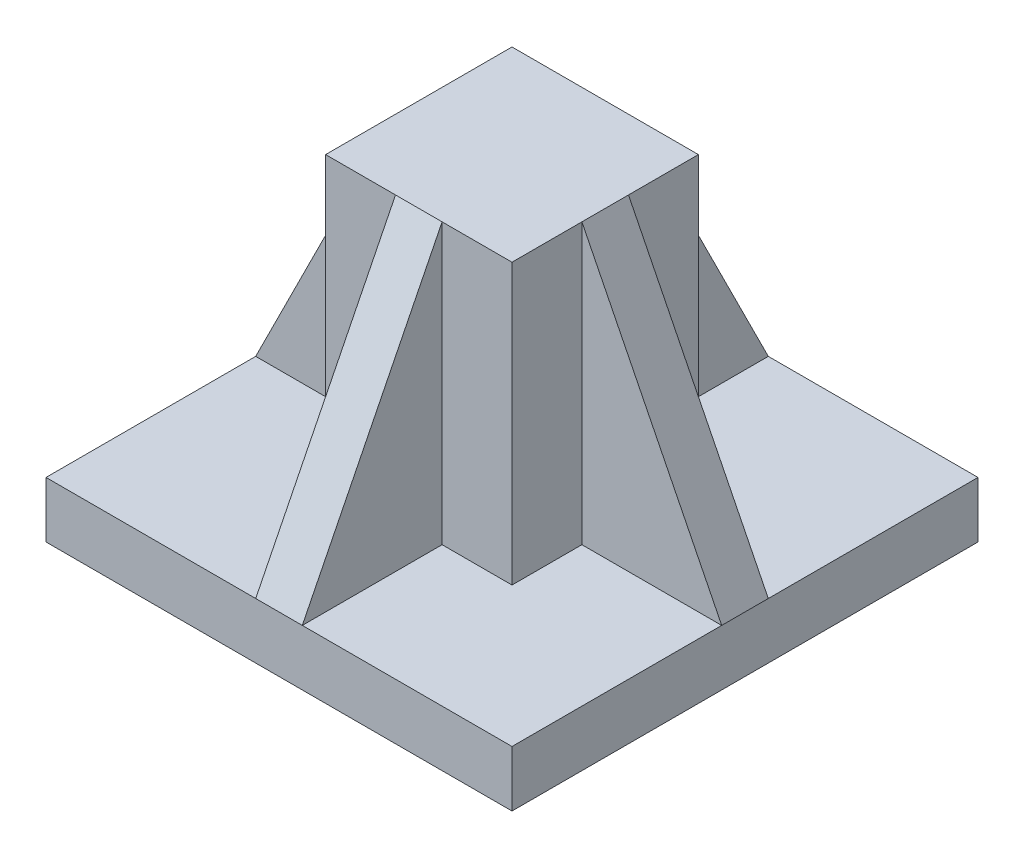
ISO-10303-21;
HEADER;
FILE_DESCRIPTION(('STEP AP214'),'2;1');
FILE_NAME('part.step','',(''),(''),'','','');
FILE_SCHEMA(('AUTOMOTIVE_DESIGN { 1 0 10303 214 1 1 1 1 }'));
ENDSEC;
DATA;
#1=APPLICATION_CONTEXT('core data for automotive mechanical design processes');
#2=APPLICATION_PROTOCOL_DEFINITION('international standard','automotive_design',2000,#1);
#3=PRODUCT_CONTEXT('',#1,'mechanical');
#4=PRODUCT('Part','Part','',(#3));
#5=PRODUCT_RELATED_PRODUCT_CATEGORY('part','',(#4));
#6=PRODUCT_DEFINITION_FORMATION('','',#4);
#7=PRODUCT_DEFINITION_CONTEXT('part definition',#1,'design');
#8=PRODUCT_DEFINITION('design','',#6,#7);
#9=PRODUCT_DEFINITION_SHAPE('','',#8);
#10=(LENGTH_UNIT() NAMED_UNIT(*) SI_UNIT(.MILLI.,.METRE.));
#11=(NAMED_UNIT(*) PLANE_ANGLE_UNIT() SI_UNIT($,.RADIAN.));
#12=(NAMED_UNIT(*) SI_UNIT($,.STERADIAN.) SOLID_ANGLE_UNIT());
#13=UNCERTAINTY_MEASURE_WITH_UNIT(LENGTH_MEASURE(1.E-05),#10,'distance_accuracy_value','');
#14=(GEOMETRIC_REPRESENTATION_CONTEXT(3) GLOBAL_UNCERTAINTY_ASSIGNED_CONTEXT((#13)) GLOBAL_UNIT_ASSIGNED_CONTEXT((#10,
#11,#12)) REPRESENTATION_CONTEXT('',''));
#15=CARTESIAN_POINT('',(0.,0.,0.));
#16=DIRECTION('',(0.,0.,1.));
#17=DIRECTION('',(1.,0.,0.));
#18=AXIS2_PLACEMENT_3D('',#15,#16,#17);
#19=CARTESIAN_POINT('',(0.,72.,0.));
#20=DIRECTION('',(0.,1.,0.));
#21=DIRECTION('',(0.,0.,1.));
#22=AXIS2_PLACEMENT_3D('',#19,#20,#21);
#23=PLANE('',#22);
#24=DIRECTION('',(0.,0.,1.));
#25=VECTOR('',#24,1.);
#26=CARTESIAN_POINT('',(20.,72.,-50.));
#27=LINE('',#26,#25);
#28=CARTESIAN_POINT('',(20.,72.,-5.00000000000001));
#29=VERTEX_POINT('',#28);
#30=CARTESIAN_POINT('',(20.,72.,4.99999999999999));
#31=VERTEX_POINT('',#30);
#32=EDGE_CURVE('E166',#29,#31,#27,.T.);
#33=ORIENTED_EDGE('',*,*,#32,.F.);
#34=DIRECTION('',(0.,0.,-1.));
#35=VECTOR('',#34,1.);
#36=CARTESIAN_POINT('',(20.,72.,-5.));
#37=LINE('',#36,#35);
#38=CARTESIAN_POINT('',(20.,72.,-20.));
#39=VERTEX_POINT('',#38);
#40=EDGE_CURVE('E206',#29,#39,#37,.T.);
#41=ORIENTED_EDGE('',*,*,#40,.T.);
#42=DIRECTION('',(1.,0.,0.));
#43=VECTOR('',#42,1.);
#44=CARTESIAN_POINT('',(5.,72.,-20.));
#45=LINE('',#44,#43);
#46=CARTESIAN_POINT('',(5.,72.,-20.));
#47=VERTEX_POINT('',#46);
#48=EDGE_CURVE('E283',#47,#39,#45,.T.);
#49=ORIENTED_EDGE('',*,*,#48,.F.);
#50=DIRECTION('',(1.,0.,0.));
#51=VECTOR('',#50,1.);
#52=CARTESIAN_POINT('',(-50.,72.,-20.));
#53=LINE('',#52,#51);
#54=CARTESIAN_POINT('',(-5.00000000000002,72.,-20.));
#55=VERTEX_POINT('',#54);
#56=EDGE_CURVE('E207',#55,#47,#53,.T.);
#57=ORIENTED_EDGE('',*,*,#56,.F.);
#58=DIRECTION('',(-1.,0.,0.));
#59=VECTOR('',#58,1.);
#60=CARTESIAN_POINT('',(-5.00000000000002,72.,-20.));
#61=LINE('',#60,#59);
#62=CARTESIAN_POINT('',(-20.,72.,-20.));
#63=VERTEX_POINT('',#62);
#64=EDGE_CURVE('E263',#55,#63,#61,.T.);
#65=ORIENTED_EDGE('',*,*,#64,.T.);
#66=DIRECTION('',(0.,0.,-1.));
#67=VECTOR('',#66,1.);
#68=CARTESIAN_POINT('',(-20.,72.,-5.));
#69=LINE('',#68,#67);
#70=CARTESIAN_POINT('',(-20.,72.,-5.));
#71=VERTEX_POINT('',#70);
#72=EDGE_CURVE('E75',#71,#63,#69,.T.);
#73=ORIENTED_EDGE('',*,*,#72,.F.);
#74=DIRECTION('',(0.,0.,1.));
#75=VECTOR('',#74,1.);
#76=CARTESIAN_POINT('',(-20.,72.,-50.));
#77=LINE('',#76,#75);
#78=CARTESIAN_POINT('',(-20.,72.,4.99999999999999));
#79=VERTEX_POINT('',#78);
#80=EDGE_CURVE('E306',#71,#79,#77,.T.);
#81=ORIENTED_EDGE('',*,*,#80,.T.);
#82=DIRECTION('',(0.,0.,1.));
#83=VECTOR('',#82,1.);
#84=CARTESIAN_POINT('',(-20.,72.,4.99999999999999));
#85=LINE('',#84,#83);
#86=CARTESIAN_POINT('',(-20.,72.,20.));
#87=VERTEX_POINT('',#86);
#88=EDGE_CURVE('E212',#79,#87,#85,.T.);
#89=ORIENTED_EDGE('',*,*,#88,.T.);
#90=DIRECTION('',(-1.,0.,0.));
#91=VECTOR('',#90,1.);
#92=CARTESIAN_POINT('',(-5.00000000000002,72.,20.));
#93=LINE('',#92,#91);
#94=CARTESIAN_POINT('',(-5.00000000000002,72.,20.));
#95=VERTEX_POINT('',#94);
#96=EDGE_CURVE('E267',#95,#87,#93,.T.);
#97=ORIENTED_EDGE('',*,*,#96,.F.);
#98=DIRECTION('',(1.,0.,0.));
#99=VECTOR('',#98,1.);
#100=CARTESIAN_POINT('',(-50.,72.,20.));
#101=LINE('',#100,#99);
#102=CARTESIAN_POINT('',(5.,72.,20.));
#103=VERTEX_POINT('',#102);
#104=EDGE_CURVE('E228',#95,#103,#101,.T.);
#105=ORIENTED_EDGE('',*,*,#104,.T.);
#106=DIRECTION('',(1.,0.,0.));
#107=VECTOR('',#106,1.);
#108=CARTESIAN_POINT('',(5.,72.,20.));
#109=LINE('',#108,#107);
#110=CARTESIAN_POINT('',(20.,72.,20.));
#111=VERTEX_POINT('',#110);
#112=EDGE_CURVE('E293',#103,#111,#109,.T.);
#113=ORIENTED_EDGE('',*,*,#112,.T.);
#114=DIRECTION('',(0.,0.,1.));
#115=VECTOR('',#114,1.);
#116=CARTESIAN_POINT('',(20.,72.,4.99999999999999));
#117=LINE('',#116,#115);
#118=EDGE_CURVE('E182',#31,#111,#117,.T.);
#119=ORIENTED_EDGE('',*,*,#118,.F.);
#120=EDGE_LOOP('',(#33,#41,#49,#57,#65,#73,#81,#89,#97,#105,#113,#119));
#121=FACE_BOUND('',#120,.T.);
#122=ADVANCED_FACE('F47',(#121),#23,.T.);
#123=CARTESIAN_POINT('',(5.,0.,0.));
#124=DIRECTION('',(-1.,0.,0.));
#125=DIRECTION('',(0.,0.,1.));
#126=AXIS2_PLACEMENT_3D('',#123,#124,#125);
#127=PLANE('',#126);
#128=DIRECTION('',(0.,-0.894427190999916,-0.447213595499958));
#129=VECTOR('',#128,1.);
#130=CARTESIAN_POINT('',(5.,72.,-20.));
#131=LINE('',#130,#129);
#132=CARTESIAN_POINT('',(5.,12.,-50.));
#133=VERTEX_POINT('',#132);
#134=EDGE_CURVE('E324',#47,#133,#131,.T.);
#135=ORIENTED_EDGE('',*,*,#134,.F.);
#136=DIRECTION('',(0.,-1.,0.));
#137=VECTOR('',#136,1.);
#138=CARTESIAN_POINT('',(5.,72.,-20.));
#139=LINE('',#138,#137);
#140=CARTESIAN_POINT('',(5.,12.,-20.));
#141=VERTEX_POINT('',#140);
#142=EDGE_CURVE('E266',#47,#141,#139,.T.);
#143=ORIENTED_EDGE('',*,*,#142,.T.);
#144=DIRECTION('',(0.,0.,-1.));
#145=VECTOR('',#144,1.);
#146=CARTESIAN_POINT('',(5.,12.,-50.));
#147=LINE('',#146,#145);
#148=EDGE_CURVE('E284',#141,#133,#147,.T.);
#149=ORIENTED_EDGE('',*,*,#148,.T.);
#150=EDGE_LOOP('',(#135,#143,#149));
#151=FACE_BOUND('',#150,.T.);
#152=ADVANCED_FACE('F333',(#151),#127,.F.);
#153=CARTESIAN_POINT('',(0.,12.,0.));
#154=DIRECTION('',(0.,1.,0.));
#155=DIRECTION('',(0.,0.,1.));
#156=AXIS2_PLACEMENT_3D('',#153,#154,#155);
#157=PLANE('',#156);
#158=DIRECTION('',(-1.,0.,0.));
#159=VECTOR('',#158,1.);
#160=CARTESIAN_POINT('',(50.,12.,-5.00000000000002));
#161=LINE('',#160,#159);
#162=CARTESIAN_POINT('',(50.,12.,-5.00000000000002));
#163=VERTEX_POINT('',#162);
#164=CARTESIAN_POINT('',(20.,12.,-5.00000000000002));
#165=VERTEX_POINT('',#164);
#166=EDGE_CURVE('E183',#163,#165,#161,.T.);
#167=ORIENTED_EDGE('',*,*,#166,.F.);
#168=DIRECTION('',(0.,0.,-1.));
#169=VECTOR('',#168,1.);
#170=CARTESIAN_POINT('',(50.,12.,-50.));
#171=LINE('',#170,#169);
#172=CARTESIAN_POINT('',(50.,12.,4.99999999999999));
#173=VERTEX_POINT('',#172);
#174=EDGE_CURVE('E167',#173,#163,#171,.T.);
#175=ORIENTED_EDGE('',*,*,#174,.F.);
#176=DIRECTION('',(1.,0.,0.));
#177=VECTOR('',#176,1.);
#178=CARTESIAN_POINT('',(50.,12.,4.99999999999999));
#179=LINE('',#178,#177);
#180=CARTESIAN_POINT('',(20.,12.,4.99999999999999));
#181=VERTEX_POINT('',#180);
#182=EDGE_CURVE('E178',#181,#173,#179,.T.);
#183=ORIENTED_EDGE('',*,*,#182,.F.);
#184=DIRECTION('',(0.,0.,1.));
#185=VECTOR('',#184,1.);
#186=CARTESIAN_POINT('',(20.,12.,4.99999999999999));
#187=LINE('',#186,#185);
#188=CARTESIAN_POINT('',(20.,12.,20.));
#189=VERTEX_POINT('',#188);
#190=EDGE_CURVE('E238',#181,#189,#187,.T.);
#191=ORIENTED_EDGE('',*,*,#190,.T.);
#192=DIRECTION('',(1.,0.,0.));
#193=VECTOR('',#192,1.);
#194=CARTESIAN_POINT('',(5.,12.,20.));
#195=LINE('',#194,#193);
#196=CARTESIAN_POINT('',(5.,12.,20.));
#197=VERTEX_POINT('',#196);
#198=EDGE_CURVE('E294',#197,#189,#195,.T.);
#199=ORIENTED_EDGE('',*,*,#198,.F.);
#200=DIRECTION('',(0.,0.,-1.));
#201=VECTOR('',#200,1.);
#202=CARTESIAN_POINT('',(5.,12.,50.));
#203=LINE('',#202,#201);
#204=CARTESIAN_POINT('',(5.,12.,50.));
#205=VERTEX_POINT('',#204);
#206=EDGE_CURVE('E286',#205,#197,#203,.T.);
#207=ORIENTED_EDGE('',*,*,#206,.F.);
#208=DIRECTION('',(1.,0.,0.));
#209=VECTOR('',#208,1.);
#210=CARTESIAN_POINT('',(-50.,12.,50.));
#211=LINE('',#210,#209);
#212=CARTESIAN_POINT('',(-5.00000000000002,12.,50.));
#213=VERTEX_POINT('',#212);
#214=EDGE_CURVE('E186',#213,#205,#211,.T.);
#215=ORIENTED_EDGE('',*,*,#214,.F.);
#216=DIRECTION('',(0.,0.,1.));
#217=VECTOR('',#216,1.);
#218=CARTESIAN_POINT('',(-5.00000000000002,12.,50.));
#219=LINE('',#218,#217);
#220=CARTESIAN_POINT('',(-5.00000000000002,12.,20.));
#221=VERTEX_POINT('',#220);
#222=EDGE_CURVE('E275',#221,#213,#219,.T.);
#223=ORIENTED_EDGE('',*,*,#222,.F.);
#224=DIRECTION('',(-1.,0.,0.));
#225=VECTOR('',#224,1.);
#226=CARTESIAN_POINT('',(-5.00000000000002,12.,20.));
#227=LINE('',#226,#225);
#228=CARTESIAN_POINT('',(-20.,12.,20.));
#229=VERTEX_POINT('',#228);
#230=EDGE_CURVE('E241',#221,#229,#227,.T.);
#231=ORIENTED_EDGE('',*,*,#230,.T.);
#232=DIRECTION('',(0.,0.,1.));
#233=VECTOR('',#232,1.);
#234=CARTESIAN_POINT('',(-20.,12.,4.99999999999999));
#235=LINE('',#234,#233);
#236=CARTESIAN_POINT('',(-20.,12.,4.99999999999999));
#237=VERTEX_POINT('',#236);
#238=EDGE_CURVE('E243',#237,#229,#235,.T.);
#239=ORIENTED_EDGE('',*,*,#238,.F.);
#240=DIRECTION('',(1.,0.,0.));
#241=VECTOR('',#240,1.);
#242=CARTESIAN_POINT('',(-50.,12.,4.99999999999999));
#243=LINE('',#242,#241);
#244=CARTESIAN_POINT('',(-50.,12.,4.99999999999999));
#245=VERTEX_POINT('',#244);
#246=EDGE_CURVE('E247',#245,#237,#243,.T.);
#247=ORIENTED_EDGE('',*,*,#246,.F.);
#248=DIRECTION('',(0.,0.,1.));
#249=VECTOR('',#248,1.);
#250=CARTESIAN_POINT('',(-50.,12.,-50.));
#251=LINE('',#250,#249);
#252=CARTESIAN_POINT('',(-50.,12.,-5.00000000000001));
#253=VERTEX_POINT('',#252);
#254=EDGE_CURVE('E193',#253,#245,#251,.T.);
#255=ORIENTED_EDGE('',*,*,#254,.F.);
#256=DIRECTION('',(-1.,0.,0.));
#257=VECTOR('',#256,1.);
#258=CARTESIAN_POINT('',(-50.,12.,-5.00000000000002));
#259=LINE('',#258,#257);
#260=CARTESIAN_POINT('',(-20.,12.,-5.00000000000002));
#261=VERTEX_POINT('',#260);
#262=EDGE_CURVE('E223',#261,#253,#259,.T.);
#263=ORIENTED_EDGE('',*,*,#262,.F.);
#264=DIRECTION('',(0.,0.,-1.));
#265=VECTOR('',#264,1.);
#266=CARTESIAN_POINT('',(-20.,12.,-5.00000000000002));
#267=LINE('',#266,#265);
#268=CARTESIAN_POINT('',(-20.,12.,-20.));
#269=VERTEX_POINT('',#268);
#270=EDGE_CURVE('E229',#261,#269,#267,.T.);
#271=ORIENTED_EDGE('',*,*,#270,.T.);
#272=DIRECTION('',(-1.,0.,0.));
#273=VECTOR('',#272,1.);
#274=CARTESIAN_POINT('',(-5.00000000000002,12.,-20.));
#275=LINE('',#274,#273);
#276=CARTESIAN_POINT('',(-5.00000000000002,12.,-20.));
#277=VERTEX_POINT('',#276);
#278=EDGE_CURVE('E265',#277,#269,#275,.T.);
#279=ORIENTED_EDGE('',*,*,#278,.F.);
#280=DIRECTION('',(0.,0.,1.));
#281=VECTOR('',#280,1.);
#282=CARTESIAN_POINT('',(-5.00000000000002,12.,-50.));
#283=LINE('',#282,#281);
#284=CARTESIAN_POINT('',(-5.00000000000002,12.,-50.));
#285=VERTEX_POINT('',#284);
#286=EDGE_CURVE('E254',#285,#277,#283,.T.);
#287=ORIENTED_EDGE('',*,*,#286,.F.);
#288=DIRECTION('',(-1.,0.,0.));
#289=VECTOR('',#288,1.);
#290=CARTESIAN_POINT('',(-50.,12.,-50.));
#291=LINE('',#290,#289);
#292=EDGE_CURVE('E189',#133,#285,#291,.T.);
#293=ORIENTED_EDGE('',*,*,#292,.F.);
#294=ORIENTED_EDGE('',*,*,#148,.F.);
#295=DIRECTION('',(1.,0.,0.));
#296=VECTOR('',#295,1.);
#297=CARTESIAN_POINT('',(5.,12.,-20.));
#298=LINE('',#297,#296);
#299=CARTESIAN_POINT('',(20.,12.,-20.));
#300=VERTEX_POINT('',#299);
#301=EDGE_CURVE('E282',#141,#300,#298,.T.);
#302=ORIENTED_EDGE('',*,*,#301,.T.);
#303=DIRECTION('',(0.,0.,-1.));
#304=VECTOR('',#303,1.);
#305=CARTESIAN_POINT('',(20.,12.,-5.00000000000002));
#306=LINE('',#305,#304);
#307=EDGE_CURVE('E63',#165,#300,#306,.T.);
#308=ORIENTED_EDGE('',*,*,#307,.F.);
#309=EDGE_LOOP('',(#167,#175,#183,#191,#199,#207,#215,#223,#231,#239,#247,#255,#263,#271,#279,
#287,#293,#294,#302,#308));
#310=FACE_BOUND('',#309,.T.);
#311=ADVANCED_FACE('F51',(#310),#157,.F.);
#312=CARTESIAN_POINT('',(5.,72.,-20.));
#313=DIRECTION('',(0.,0.,1.));
#314=DIRECTION('',(0.,-1.,0.));
#315=AXIS2_PLACEMENT_3D('',#312,#313,#314);
#316=PLANE('',#315);
#317=DIRECTION('',(0.,1.,0.));
#318=VECTOR('',#317,1.);
#319=CARTESIAN_POINT('',(20.,72.,-20.));
#320=LINE('',#319,#318);
#321=EDGE_CURVE('E213',#300,#39,#320,.T.);
#322=ORIENTED_EDGE('',*,*,#321,.F.);
#323=ORIENTED_EDGE('',*,*,#301,.F.);
#324=ORIENTED_EDGE('',*,*,#142,.F.);
#325=ORIENTED_EDGE('',*,*,#48,.T.);
#326=EDGE_LOOP('',(#322,#323,#324,#325));
#327=FACE_BOUND('',#326,.T.);
#328=ADVANCED_FACE('F375',(#327),#316,.F.);
#329=CARTESIAN_POINT('',(-5.00000000000002,12.,-20.));
#330=DIRECTION('',(0.,0.,1.));
#331=DIRECTION('',(1.,0.,0.));
#332=AXIS2_PLACEMENT_3D('',#329,#330,#331);
#333=PLANE('',#332);
#334=DIRECTION('',(0.,-1.,0.));
#335=VECTOR('',#334,1.);
#336=CARTESIAN_POINT('',(-20.,72.,-20.));
#337=LINE('',#336,#335);
#338=EDGE_CURVE('E225',#63,#269,#337,.T.);
#339=ORIENTED_EDGE('',*,*,#338,.F.);
#340=ORIENTED_EDGE('',*,*,#64,.F.);
#341=DIRECTION('',(0.,1.,0.));
#342=VECTOR('',#341,1.);
#343=CARTESIAN_POINT('',(-5.00000000000002,12.,-20.));
#344=LINE('',#343,#342);
#345=EDGE_CURVE('E256',#277,#55,#344,.T.);
#346=ORIENTED_EDGE('',*,*,#345,.F.);
#347=ORIENTED_EDGE('',*,*,#278,.T.);
#348=EDGE_LOOP('',(#339,#340,#346,#347));
#349=FACE_BOUND('',#348,.T.);
#350=ADVANCED_FACE('F345',(#349),#333,.F.);
#351=CARTESIAN_POINT('',(5.,72.,20.));
#352=DIRECTION('',(0.,0.,-1.));
#353=DIRECTION('',(0.,1.,0.));
#354=AXIS2_PLACEMENT_3D('',#351,#352,#353);
#355=PLANE('',#354);
#356=DIRECTION('',(0.,-1.,0.));
#357=VECTOR('',#356,1.);
#358=CARTESIAN_POINT('',(20.,12.,20.));
#359=LINE('',#358,#357);
#360=EDGE_CURVE('E237',#111,#189,#359,.T.);
#361=ORIENTED_EDGE('',*,*,#360,.F.);
#362=ORIENTED_EDGE('',*,*,#112,.F.);
#363=DIRECTION('',(0.,1.,0.));
#364=VECTOR('',#363,1.);
#365=CARTESIAN_POINT('',(5.,72.,20.));
#366=LINE('',#365,#364);
#367=EDGE_CURVE('E292',#197,#103,#366,.T.);
#368=ORIENTED_EDGE('',*,*,#367,.F.);
#369=ORIENTED_EDGE('',*,*,#198,.T.);
#370=EDGE_LOOP('',(#361,#362,#368,#369));
#371=FACE_BOUND('',#370,.T.);
#372=ADVANCED_FACE('F361',(#371),#355,.F.);
#373=CARTESIAN_POINT('',(-5.00000000000002,72.,20.));
#374=DIRECTION('',(0.,0.,-1.));
#375=DIRECTION('',(0.,1.,0.));
#376=AXIS2_PLACEMENT_3D('',#373,#374,#375);
#377=PLANE('',#376);
#378=DIRECTION('',(0.,1.,0.));
#379=VECTOR('',#378,1.);
#380=CARTESIAN_POINT('',(-20.,72.,20.));
#381=LINE('',#380,#379);
#382=EDGE_CURVE('E239',#229,#87,#381,.T.);
#383=ORIENTED_EDGE('',*,*,#382,.F.);
#384=ORIENTED_EDGE('',*,*,#230,.F.);
#385=DIRECTION('',(0.,-1.,0.));
#386=VECTOR('',#385,1.);
#387=CARTESIAN_POINT('',(-5.00000000000002,72.,20.));
#388=LINE('',#387,#386);
#389=EDGE_CURVE('E259',#95,#221,#388,.T.);
#390=ORIENTED_EDGE('',*,*,#389,.F.);
#391=ORIENTED_EDGE('',*,*,#96,.T.);
#392=EDGE_LOOP('',(#383,#384,#390,#391));
#393=FACE_BOUND('',#392,.T.);
#394=ADVANCED_FACE('F316',(#393),#377,.F.);
#395=CARTESIAN_POINT('',(5.,0.,0.));
#396=DIRECTION('',(1.,0.,0.));
#397=DIRECTION('',(0.,0.,-1.));
#398=AXIS2_PLACEMENT_3D('',#395,#396,#397);
#399=PLANE('',#398);
#400=DIRECTION('',(0.,0.894427190999916,-0.447213595499958));
#401=VECTOR('',#400,1.);
#402=CARTESIAN_POINT('',(5.,72.,20.));
#403=LINE('',#402,#401);
#404=EDGE_CURVE('E323',#205,#103,#403,.T.);
#405=ORIENTED_EDGE('',*,*,#404,.F.);
#406=ORIENTED_EDGE('',*,*,#206,.T.);
#407=ORIENTED_EDGE('',*,*,#367,.T.);
#408=EDGE_LOOP('',(#405,#406,#407));
#409=FACE_BOUND('',#408,.T.);
#410=ADVANCED_FACE('F370',(#409),#399,.T.);
#411=CARTESIAN_POINT('',(-5.00000000000002,0.,0.));
#412=DIRECTION('',(1.,0.,0.));
#413=DIRECTION('',(0.,0.,-1.));
#414=AXIS2_PLACEMENT_3D('',#411,#412,#413);
#415=PLANE('',#414);
#416=ORIENTED_EDGE('',*,*,#222,.T.);
#417=DIRECTION('',(0.,0.894427190999916,-0.447213595499958));
#418=VECTOR('',#417,1.);
#419=CARTESIAN_POINT('',(-5.00000000000002,22.4,44.8));
#420=LINE('',#419,#418);
#421=EDGE_CURVE('E197',#213,#95,#420,.T.);
#422=ORIENTED_EDGE('',*,*,#421,.T.);
#423=ORIENTED_EDGE('',*,*,#389,.T.);
#424=EDGE_LOOP('',(#416,#422,#423));
#425=FACE_BOUND('',#424,.T.);
#426=ADVANCED_FACE('F367',(#425),#415,.F.);
#427=CARTESIAN_POINT('',(-5.00000000000002,0.,0.));
#428=DIRECTION('',(1.,0.,0.));
#429=DIRECTION('',(0.,0.,-1.));
#430=AXIS2_PLACEMENT_3D('',#427,#428,#429);
#431=PLANE('',#430);
#432=ORIENTED_EDGE('',*,*,#345,.T.);
#433=DIRECTION('',(0.,-0.894427190999916,-0.447213595499958));
#434=VECTOR('',#433,1.);
#435=CARTESIAN_POINT('',(-5.00000000000002,22.4,-44.8));
#436=LINE('',#435,#434);
#437=EDGE_CURVE('E188',#55,#285,#436,.T.);
#438=ORIENTED_EDGE('',*,*,#437,.T.);
#439=ORIENTED_EDGE('',*,*,#286,.T.);
#440=EDGE_LOOP('',(#432,#438,#439));
#441=FACE_BOUND('',#440,.T.);
#442=ADVANCED_FACE('F338',(#441),#431,.F.);
#443=CARTESIAN_POINT('',(-20.,72.,4.99999999999999));
#444=DIRECTION('',(1.,0.,0.));
#445=DIRECTION('',(0.,1.,0.));
#446=AXIS2_PLACEMENT_3D('',#443,#444,#445);
#447=PLANE('',#446);
#448=ORIENTED_EDGE('',*,*,#382,.T.);
#449=ORIENTED_EDGE('',*,*,#88,.F.);
#450=DIRECTION('',(0.,1.,0.));
#451=VECTOR('',#450,1.);
#452=CARTESIAN_POINT('',(-20.,72.,4.99999999999999));
#453=LINE('',#452,#451);
#454=EDGE_CURVE('E248',#237,#79,#453,.T.);
#455=ORIENTED_EDGE('',*,*,#454,.F.);
#456=ORIENTED_EDGE('',*,*,#238,.T.);
#457=EDGE_LOOP('',(#448,#449,#455,#456));
#458=FACE_BOUND('',#457,.T.);
#459=ADVANCED_FACE('F311',(#458),#447,.F.);
#460=CARTESIAN_POINT('',(0.,0.,4.99999999999999));
#461=DIRECTION('',(0.,0.,1.));
#462=DIRECTION('',(1.,0.,0.));
#463=AXIS2_PLACEMENT_3D('',#460,#461,#462);
#464=PLANE('',#463);
#465=DIRECTION('',(0.447213595499958,0.894427190999916,0.));
#466=VECTOR('',#465,1.);
#467=CARTESIAN_POINT('',(-50.,12.,4.99999999999999));
#468=LINE('',#467,#466);
#469=EDGE_CURVE('E175',#245,#79,#468,.T.);
#470=ORIENTED_EDGE('',*,*,#469,.F.);
#471=ORIENTED_EDGE('',*,*,#246,.T.);
#472=ORIENTED_EDGE('',*,*,#454,.T.);
#473=EDGE_LOOP('',(#470,#471,#472));
#474=FACE_BOUND('',#473,.T.);
#475=ADVANCED_FACE('F308',(#474),#464,.T.);
#476=CARTESIAN_POINT('',(20.,12.,4.99999999999999));
#477=DIRECTION('',(-1.,0.,0.));
#478=DIRECTION('',(0.,0.,1.));
#479=AXIS2_PLACEMENT_3D('',#476,#477,#478);
#480=PLANE('',#479);
#481=ORIENTED_EDGE('',*,*,#360,.T.);
#482=ORIENTED_EDGE('',*,*,#190,.F.);
#483=DIRECTION('',(0.,-1.,0.));
#484=VECTOR('',#483,1.);
#485=CARTESIAN_POINT('',(20.,12.,4.99999999999999));
#486=LINE('',#485,#484);
#487=EDGE_CURVE('E176',#31,#181,#486,.T.);
#488=ORIENTED_EDGE('',*,*,#487,.F.);
#489=ORIENTED_EDGE('',*,*,#118,.T.);
#490=EDGE_LOOP('',(#481,#482,#488,#489));
#491=FACE_BOUND('',#490,.T.);
#492=ADVANCED_FACE('F390',(#491),#480,.F.);
#493=CARTESIAN_POINT('',(0.,0.,4.99999999999999));
#494=DIRECTION('',(0.,0.,1.));
#495=DIRECTION('',(1.,0.,0.));
#496=AXIS2_PLACEMENT_3D('',#493,#494,#495);
#497=PLANE('',#496);
#498=DIRECTION('',(0.447213595499958,-0.894427190999916,0.));
#499=VECTOR('',#498,1.);
#500=CARTESIAN_POINT('',(50.,12.,4.99999999999999));
#501=LINE('',#500,#499);
#502=EDGE_CURVE('E165',#31,#173,#501,.T.);
#503=ORIENTED_EDGE('',*,*,#502,.F.);
#504=ORIENTED_EDGE('',*,*,#487,.T.);
#505=ORIENTED_EDGE('',*,*,#182,.T.);
#506=EDGE_LOOP('',(#503,#504,#505));
#507=FACE_BOUND('',#506,.T.);
#508=ADVANCED_FACE('F180',(#507),#497,.T.);
#509=CARTESIAN_POINT('',(-20.,72.,-5.));
#510=DIRECTION('',(1.,0.,0.));
#511=DIRECTION('',(0.,1.,0.));
#512=AXIS2_PLACEMENT_3D('',#509,#510,#511);
#513=PLANE('',#512);
#514=ORIENTED_EDGE('',*,*,#338,.T.);
#515=ORIENTED_EDGE('',*,*,#270,.F.);
#516=DIRECTION('',(0.,-1.,0.));
#517=VECTOR('',#516,1.);
#518=CARTESIAN_POINT('',(-20.,72.,-5.));
#519=LINE('',#518,#517);
#520=EDGE_CURVE('E233',#71,#261,#519,.T.);
#521=ORIENTED_EDGE('',*,*,#520,.F.);
#522=ORIENTED_EDGE('',*,*,#72,.T.);
#523=EDGE_LOOP('',(#514,#515,#521,#522));
#524=FACE_BOUND('',#523,.T.);
#525=ADVANCED_FACE('F341',(#524),#513,.F.);
#526=CARTESIAN_POINT('',(0.,0.,-5.00000000000002));
#527=DIRECTION('',(0.,0.,1.));
#528=DIRECTION('',(0.,-1.,0.));
#529=AXIS2_PLACEMENT_3D('',#526,#527,#528);
#530=PLANE('',#529);
#531=ORIENTED_EDGE('',*,*,#262,.T.);
#532=DIRECTION('',(0.447213595499958,0.894427190999916,0.));
#533=VECTOR('',#532,1.);
#534=CARTESIAN_POINT('',(-44.8,22.4,-5.00000000000002));
#535=LINE('',#534,#533);
#536=EDGE_CURVE('E12',#253,#71,#535,.T.);
#537=ORIENTED_EDGE('',*,*,#536,.T.);
#538=ORIENTED_EDGE('',*,*,#520,.T.);
#539=EDGE_LOOP('',(#531,#537,#538));
#540=FACE_BOUND('',#539,.T.);
#541=ADVANCED_FACE('F342',(#540),#530,.F.);
#542=CARTESIAN_POINT('',(20.,72.,-5.));
#543=DIRECTION('',(-1.,0.,0.));
#544=DIRECTION('',(0.,-1.,0.));
#545=AXIS2_PLACEMENT_3D('',#542,#543,#544);
#546=PLANE('',#545);
#547=ORIENTED_EDGE('',*,*,#321,.T.);
#548=ORIENTED_EDGE('',*,*,#40,.F.);
#549=DIRECTION('',(0.,1.,0.));
#550=VECTOR('',#549,1.);
#551=CARTESIAN_POINT('',(20.,72.,-5.));
#552=LINE('',#551,#550);
#553=EDGE_CURVE('E215',#165,#29,#552,.T.);
#554=ORIENTED_EDGE('',*,*,#553,.F.);
#555=ORIENTED_EDGE('',*,*,#307,.T.);
#556=EDGE_LOOP('',(#547,#548,#554,#555));
#557=FACE_BOUND('',#556,.T.);
#558=ADVANCED_FACE('F211',(#557),#546,.F.);
#559=CARTESIAN_POINT('',(0.,0.,-5.00000000000002));
#560=DIRECTION('',(0.,0.,-1.));
#561=DIRECTION('',(0.,1.,0.));
#562=AXIS2_PLACEMENT_3D('',#559,#560,#561);
#563=PLANE('',#562);
#564=DIRECTION('',(-0.447213595499958,0.894427190999916,0.));
#565=VECTOR('',#564,1.);
#566=CARTESIAN_POINT('',(44.8,22.4,-5.00000000000002));
#567=LINE('',#566,#565);
#568=EDGE_CURVE('E60',#163,#29,#567,.T.);
#569=ORIENTED_EDGE('',*,*,#568,.F.);
#570=ORIENTED_EDGE('',*,*,#166,.T.);
#571=ORIENTED_EDGE('',*,*,#553,.T.);
#572=EDGE_LOOP('',(#569,#570,#571));
#573=FACE_BOUND('',#572,.T.);
#574=ADVANCED_FACE('F216',(#573),#563,.T.);
#575=CARTESIAN_POINT('',(-50.,72.,-20.));
#576=DIRECTION('',(0.,-0.447213595499958,0.894427190999916));
#577=DIRECTION('',(0.,-0.894427190999916,-0.447213595499958));
#578=AXIS2_PLACEMENT_3D('',#575,#576,#577);
#579=PLANE('',#578);
#580=ORIENTED_EDGE('',*,*,#56,.T.);
#581=ORIENTED_EDGE('',*,*,#134,.T.);
#582=ORIENTED_EDGE('',*,*,#292,.T.);
#583=ORIENTED_EDGE('',*,*,#437,.F.);
#584=EDGE_LOOP('',(#580,#581,#582,#583));
#585=FACE_BOUND('',#584,.T.);
#586=ADVANCED_FACE('F328',(#585),#579,.F.);
#587=CARTESIAN_POINT('',(-50.,72.,20.));
#588=DIRECTION('',(0.,-0.447213595499958,-0.894427190999916));
#589=DIRECTION('',(0.,0.894427190999916,-0.447213595499958));
#590=AXIS2_PLACEMENT_3D('',#587,#588,#589);
#591=PLANE('',#590);
#592=ORIENTED_EDGE('',*,*,#214,.T.);
#593=ORIENTED_EDGE('',*,*,#404,.T.);
#594=ORIENTED_EDGE('',*,*,#104,.F.);
#595=ORIENTED_EDGE('',*,*,#421,.F.);
#596=EDGE_LOOP('',(#592,#593,#594,#595));
#597=FACE_BOUND('',#596,.T.);
#598=ADVANCED_FACE('F445',(#597),#591,.F.);
#599=CARTESIAN_POINT('',(50.,12.,-50.));
#600=DIRECTION('',(-0.894427190999916,-0.447213595499958,0.));
#601=DIRECTION('',(0.447213595499958,-0.894427190999916,0.));
#602=AXIS2_PLACEMENT_3D('',#599,#600,#601);
#603=PLANE('',#602);
#604=ORIENTED_EDGE('',*,*,#568,.T.);
#605=ORIENTED_EDGE('',*,*,#32,.T.);
#606=ORIENTED_EDGE('',*,*,#502,.T.);
#607=ORIENTED_EDGE('',*,*,#174,.T.);
#608=EDGE_LOOP('',(#604,#605,#606,#607));
#609=FACE_BOUND('',#608,.T.);
#610=ADVANCED_FACE('F163',(#609),#603,.F.);
#611=CARTESIAN_POINT('',(-50.,12.,-50.));
#612=DIRECTION('',(0.894427190999916,-0.447213595499958,0.));
#613=DIRECTION('',(0.447213595499958,0.894427190999916,0.));
#614=AXIS2_PLACEMENT_3D('',#611,#612,#613);
#615=PLANE('',#614);
#616=ORIENTED_EDGE('',*,*,#254,.T.);
#617=ORIENTED_EDGE('',*,*,#469,.T.);
#618=ORIENTED_EDGE('',*,*,#80,.F.);
#619=ORIENTED_EDGE('',*,*,#536,.F.);
#620=EDGE_LOOP('',(#616,#617,#618,#619));
#621=FACE_BOUND('',#620,.T.);
#622=ADVANCED_FACE('F303',(#621),#615,.F.);
#623=CLOSED_SHELL('',(#122,#152,#311,#328,#350,#372,#394,#410,#426,#442,#459,#475,#492,#508,
#525,#541,#558,#574,#586,#598,#610,#622));
#624=MANIFOLD_SOLID_BREP('B2',#623);
#625=CARTESIAN_POINT('',(50.,12.,-50.));
#626=DIRECTION('',(-1.,0.,0.));
#627=DIRECTION('',(0.,0.,1.));
#628=AXIS2_PLACEMENT_3D('',#625,#626,#627);
#629=PLANE('',#628);
#630=DIRECTION('',(0.,0.,-1.));
#631=VECTOR('',#630,1.);
#632=CARTESIAN_POINT('',(50.,0.,-50.));
#633=LINE('',#632,#631);
#634=CARTESIAN_POINT('',(50.,0.,50.));
#635=VERTEX_POINT('',#634);
#636=CARTESIAN_POINT('',(50.,0.,-50.));
#637=VERTEX_POINT('',#636);
#638=EDGE_CURVE('E603',#635,#637,#633,.T.);
#639=ORIENTED_EDGE('',*,*,#638,.T.);
#640=DIRECTION('',(0.,-1.,0.));
#641=VECTOR('',#640,1.);
#642=CARTESIAN_POINT('',(50.,12.,-50.));
#643=LINE('',#642,#641);
#644=CARTESIAN_POINT('',(50.,12.,-50.));
#645=VERTEX_POINT('',#644);
#646=EDGE_CURVE('E50',#645,#637,#643,.T.);
#647=ORIENTED_EDGE('',*,*,#646,.F.);
#648=DIRECTION('',(0.,0.,-1.));
#649=VECTOR('',#648,1.);
#650=CARTESIAN_POINT('',(50.,12.,-50.));
#651=LINE('',#650,#649);
#652=CARTESIAN_POINT('',(50.,12.,50.));
#653=VERTEX_POINT('',#652);
#654=EDGE_CURVE('E584',#653,#645,#651,.T.);
#655=ORIENTED_EDGE('',*,*,#654,.F.);
#656=DIRECTION('',(0.,-1.,0.));
#657=VECTOR('',#656,1.);
#658=CARTESIAN_POINT('',(50.,12.,50.));
#659=LINE('',#658,#657);
#660=EDGE_CURVE('E599',#653,#635,#659,.T.);
#661=ORIENTED_EDGE('',*,*,#660,.T.);
#662=EDGE_LOOP('',(#639,#647,#655,#661));
#663=FACE_BOUND('',#662,.T.);
#664=ADVANCED_FACE('F541',(#663),#629,.F.);
#665=CARTESIAN_POINT('',(-50.,12.,-50.));
#666=DIRECTION('',(0.,0.,1.));
#667=DIRECTION('',(1.,0.,0.));
#668=AXIS2_PLACEMENT_3D('',#665,#666,#667);
#669=PLANE('',#668);
#670=DIRECTION('',(-1.,0.,0.));
#671=VECTOR('',#670,1.);
#672=CARTESIAN_POINT('',(-50.,0.,-50.));
#673=LINE('',#672,#671);
#674=CARTESIAN_POINT('',(-50.,0.,-50.));
#675=VERTEX_POINT('',#674);
#676=EDGE_CURVE('E596',#637,#675,#673,.T.);
#677=ORIENTED_EDGE('',*,*,#676,.T.);
#678=DIRECTION('',(0.,-1.,0.));
#679=VECTOR('',#678,1.);
#680=CARTESIAN_POINT('',(-50.,12.,-50.));
#681=LINE('',#680,#679);
#682=CARTESIAN_POINT('',(-50.,12.,-50.));
#683=VERTEX_POINT('',#682);
#684=EDGE_CURVE('E548',#683,#675,#681,.T.);
#685=ORIENTED_EDGE('',*,*,#684,.F.);
#686=DIRECTION('',(-1.,0.,0.));
#687=VECTOR('',#686,1.);
#688=CARTESIAN_POINT('',(-50.,12.,-50.));
#689=LINE('',#688,#687);
#690=EDGE_CURVE('E590',#645,#683,#689,.T.);
#691=ORIENTED_EDGE('',*,*,#690,.F.);
#692=ORIENTED_EDGE('',*,*,#646,.T.);
#693=EDGE_LOOP('',(#677,#685,#691,#692));
#694=FACE_BOUND('',#693,.T.);
#695=ADVANCED_FACE('F594',(#694),#669,.F.);
#696=CARTESIAN_POINT('',(-50.,12.,-50.));
#697=DIRECTION('',(1.,0.,0.));
#698=DIRECTION('',(0.,0.,-1.));
#699=AXIS2_PLACEMENT_3D('',#696,#697,#698);
#700=PLANE('',#699);
#701=DIRECTION('',(0.,0.,1.));
#702=VECTOR('',#701,1.);
#703=CARTESIAN_POINT('',(-50.,0.,-50.));
#704=LINE('',#703,#702);
#705=CARTESIAN_POINT('',(-50.,0.,50.));
#706=VERTEX_POINT('',#705);
#707=EDGE_CURVE('E573',#675,#706,#704,.T.);
#708=ORIENTED_EDGE('',*,*,#707,.T.);
#709=DIRECTION('',(0.,-1.,0.));
#710=VECTOR('',#709,1.);
#711=CARTESIAN_POINT('',(-50.,12.,50.));
#712=LINE('',#711,#710);
#713=CARTESIAN_POINT('',(-50.,12.,50.));
#714=VERTEX_POINT('',#713);
#715=EDGE_CURVE('E600',#714,#706,#712,.T.);
#716=ORIENTED_EDGE('',*,*,#715,.F.);
#717=DIRECTION('',(0.,0.,1.));
#718=VECTOR('',#717,1.);
#719=CARTESIAN_POINT('',(-50.,12.,-50.));
#720=LINE('',#719,#718);
#721=EDGE_CURVE('E591',#683,#714,#720,.T.);
#722=ORIENTED_EDGE('',*,*,#721,.F.);
#723=ORIENTED_EDGE('',*,*,#684,.T.);
#724=EDGE_LOOP('',(#708,#716,#722,#723));
#725=FACE_BOUND('',#724,.T.);
#726=ADVANCED_FACE('F598',(#725),#700,.F.);
#727=CARTESIAN_POINT('',(-50.,12.,50.));
#728=DIRECTION('',(0.,0.,-1.));
#729=DIRECTION('',(-1.,0.,0.));
#730=AXIS2_PLACEMENT_3D('',#727,#728,#729);
#731=PLANE('',#730);
#732=DIRECTION('',(1.,0.,0.));
#733=VECTOR('',#732,1.);
#734=CARTESIAN_POINT('',(-50.,0.,50.));
#735=LINE('',#734,#733);
#736=EDGE_CURVE('E577',#706,#635,#735,.T.);
#737=ORIENTED_EDGE('',*,*,#736,.T.);
#738=ORIENTED_EDGE('',*,*,#660,.F.);
#739=DIRECTION('',(1.,0.,0.));
#740=VECTOR('',#739,1.);
#741=CARTESIAN_POINT('',(-50.,12.,50.));
#742=LINE('',#741,#740);
#743=EDGE_CURVE('E556',#714,#653,#742,.T.);
#744=ORIENTED_EDGE('',*,*,#743,.F.);
#745=ORIENTED_EDGE('',*,*,#715,.T.);
#746=EDGE_LOOP('',(#737,#738,#744,#745));
#747=FACE_BOUND('',#746,.T.);
#748=ADVANCED_FACE('F614',(#747),#731,.F.);
#749=CARTESIAN_POINT('',(0.,12.,0.));
#750=DIRECTION('',(0.,1.,0.));
#751=DIRECTION('',(0.,0.,1.));
#752=AXIS2_PLACEMENT_3D('',#749,#750,#751);
#753=PLANE('',#752);
#754=ORIENTED_EDGE('',*,*,#721,.T.);
#755=ORIENTED_EDGE('',*,*,#743,.T.);
#756=ORIENTED_EDGE('',*,*,#654,.T.);
#757=ORIENTED_EDGE('',*,*,#690,.T.);
#758=EDGE_LOOP('',(#754,#755,#756,#757));
#759=FACE_BOUND('',#758,.T.);
#760=ADVANCED_FACE('F589',(#759),#753,.T.);
#761=CARTESIAN_POINT('',(0.,0.,0.));
#762=DIRECTION('',(0.,1.,0.));
#763=DIRECTION('',(0.,0.,1.));
#764=AXIS2_PLACEMENT_3D('',#761,#762,#763);
#765=PLANE('',#764);
#766=ORIENTED_EDGE('',*,*,#638,.F.);
#767=ORIENTED_EDGE('',*,*,#736,.F.);
#768=ORIENTED_EDGE('',*,*,#707,.F.);
#769=ORIENTED_EDGE('',*,*,#676,.F.);
#770=EDGE_LOOP('',(#766,#767,#768,#769));
#771=FACE_BOUND('',#770,.T.);
#772=ADVANCED_FACE('F613',(#771),#765,.F.);
#773=CLOSED_SHELL('',(#664,#695,#726,#748,#760,#772));
#774=MANIFOLD_SOLID_BREP('B6',#773);
#775=ADVANCED_BREP_SHAPE_REPRESENTATION('',(#18,#624,#774),#14);
#776=SHAPE_DEFINITION_REPRESENTATION(#9,#775);
ENDSEC;
END-ISO-10303-21;
